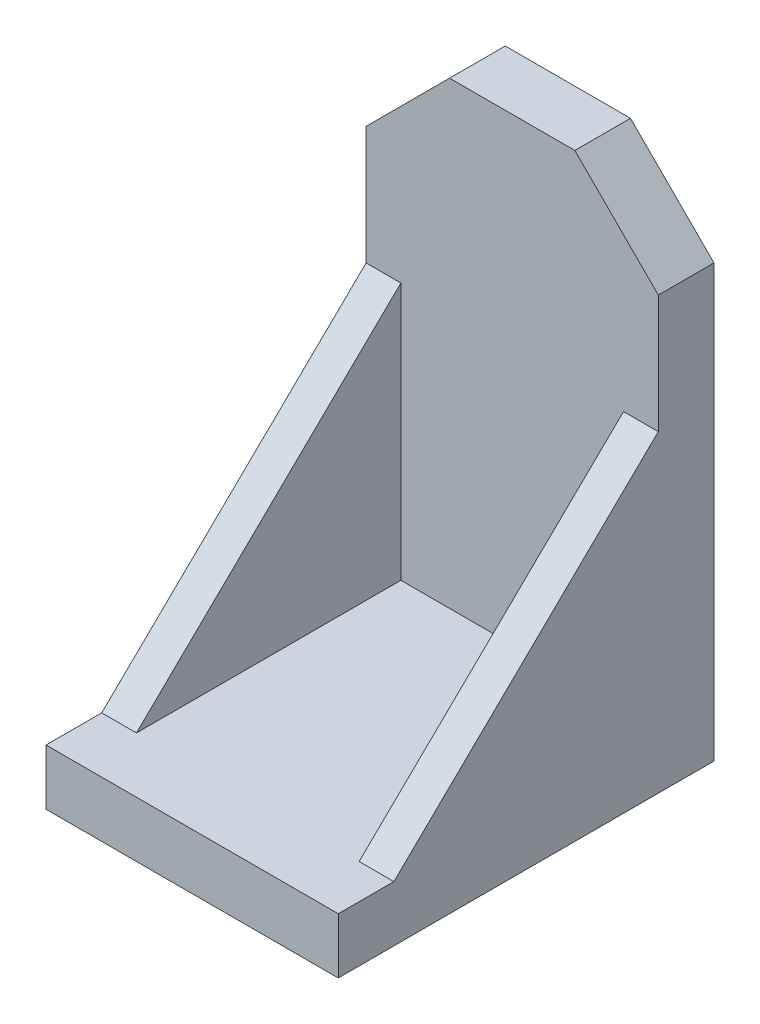
ISO-10303-21;
HEADER;
FILE_DESCRIPTION(('STEP AP214'),'2;1');
FILE_NAME('part.step','',(''),(''),'','','');
FILE_SCHEMA(('AUTOMOTIVE_DESIGN { 1 0 10303 214 1 1 1 1 }'));
ENDSEC;
DATA;
#1=APPLICATION_CONTEXT('core data for automotive mechanical design processes');
#2=APPLICATION_PROTOCOL_DEFINITION('international standard','automotive_design',2000,#1);
#3=PRODUCT_CONTEXT('',#1,'mechanical');
#4=PRODUCT('Part','Part','',(#3));
#5=PRODUCT_RELATED_PRODUCT_CATEGORY('part','',(#4));
#6=PRODUCT_DEFINITION_FORMATION('','',#4);
#7=PRODUCT_DEFINITION_CONTEXT('part definition',#1,'design');
#8=PRODUCT_DEFINITION('design','',#6,#7);
#9=PRODUCT_DEFINITION_SHAPE('','',#8);
#10=(LENGTH_UNIT() NAMED_UNIT(*) SI_UNIT(.MILLI.,.METRE.));
#11=(NAMED_UNIT(*) PLANE_ANGLE_UNIT() SI_UNIT($,.RADIAN.));
#12=(NAMED_UNIT(*) SI_UNIT($,.STERADIAN.) SOLID_ANGLE_UNIT());
#13=UNCERTAINTY_MEASURE_WITH_UNIT(LENGTH_MEASURE(1.E-05),#10,'distance_accuracy_value','');
#14=(GEOMETRIC_REPRESENTATION_CONTEXT(3) GLOBAL_UNCERTAINTY_ASSIGNED_CONTEXT((#13)) GLOBAL_UNIT_ASSIGNED_CONTEXT((#10,
#11,#12)) REPRESENTATION_CONTEXT('',''));
#15=CARTESIAN_POINT('',(0.,0.,0.));
#16=DIRECTION('',(0.,0.,1.));
#17=DIRECTION('',(1.,0.,0.));
#18=AXIS2_PLACEMENT_3D('',#15,#16,#17);
#19=CARTESIAN_POINT('',(0.,0.,8.));
#20=DIRECTION('',(0.,0.,-1.));
#21=DIRECTION('',(-1.,0.,0.));
#22=AXIS2_PLACEMENT_3D('',#19,#20,#21);
#23=PLANE('',#22);
#24=DIRECTION('',(0.,-1.,0.));
#25=VECTOR('',#24,1.);
#26=CARTESIAN_POINT('',(0.,0.,8.));
#27=LINE('',#26,#25);
#28=CARTESIAN_POINT('',(0.,62.,8.));
#29=VERTEX_POINT('',#28);
#30=CARTESIAN_POINT('',(0.,45.,8.));
#31=VERTEX_POINT('',#30);
#32=EDGE_CURVE('E57',#29,#31,#27,.T.);
#33=ORIENTED_EDGE('',*,*,#32,.T.);
#34=DIRECTION('',(-1.,0.,0.));
#35=VECTOR('',#34,1.);
#36=CARTESIAN_POINT('',(5.,45.,8.));
#37=LINE('',#36,#35);
#38=CARTESIAN_POINT('',(5.,45.,8.));
#39=VERTEX_POINT('',#38);
#40=EDGE_CURVE('E52',#39,#31,#37,.T.);
#41=ORIENTED_EDGE('',*,*,#40,.F.);
#42=DIRECTION('',(0.,1.,0.));
#43=VECTOR('',#42,1.);
#44=CARTESIAN_POINT('',(5.,7.99999999999999,8.));
#45=LINE('',#44,#43);
#46=CARTESIAN_POINT('',(5.,8.,8.));
#47=VERTEX_POINT('',#46);
#48=EDGE_CURVE('E137',#47,#39,#45,.T.);
#49=ORIENTED_EDGE('',*,*,#48,.F.);
#50=DIRECTION('',(-1.,0.,0.));
#51=VECTOR('',#50,1.);
#52=CARTESIAN_POINT('',(42.,8.,8.));
#53=LINE('',#52,#51);
#54=CARTESIAN_POINT('',(37.,8.,8.));
#55=VERTEX_POINT('',#54);
#56=EDGE_CURVE('E125',#55,#47,#53,.T.);
#57=ORIENTED_EDGE('',*,*,#56,.F.);
#58=DIRECTION('',(0.,1.,0.));
#59=VECTOR('',#58,1.);
#60=CARTESIAN_POINT('',(37.,7.99999999999999,8.));
#61=LINE('',#60,#59);
#62=CARTESIAN_POINT('',(37.,45.,8.));
#63=VERTEX_POINT('',#62);
#64=EDGE_CURVE('E154',#55,#63,#61,.T.);
#65=ORIENTED_EDGE('',*,*,#64,.T.);
#66=DIRECTION('',(1.,0.,0.));
#67=VECTOR('',#66,1.);
#68=CARTESIAN_POINT('',(37.,45.,8.));
#69=LINE('',#68,#67);
#70=CARTESIAN_POINT('',(42.,45.,8.));
#71=VERTEX_POINT('',#70);
#72=EDGE_CURVE('E159',#63,#71,#69,.T.);
#73=ORIENTED_EDGE('',*,*,#72,.T.);
#74=DIRECTION('',(0.,1.,0.));
#75=VECTOR('',#74,1.);
#76=CARTESIAN_POINT('',(42.,62.,8.));
#77=LINE('',#76,#75);
#78=CARTESIAN_POINT('',(42.,62.,8.));
#79=VERTEX_POINT('',#78);
#80=EDGE_CURVE('E180',#71,#79,#77,.T.);
#81=ORIENTED_EDGE('',*,*,#80,.T.);
#82=DIRECTION('',(-0.707106781186548,0.707106781186547,0.));
#83=VECTOR('',#82,1.);
#84=CARTESIAN_POINT('',(30.,74.,8.));
#85=LINE('',#84,#83);
#86=CARTESIAN_POINT('',(30.,74.,8.));
#87=VERTEX_POINT('',#86);
#88=EDGE_CURVE('E182',#79,#87,#85,.T.);
#89=ORIENTED_EDGE('',*,*,#88,.T.);
#90=DIRECTION('',(-1.,0.,0.));
#91=VECTOR('',#90,1.);
#92=CARTESIAN_POINT('',(12.,74.,8.));
#93=LINE('',#92,#91);
#94=CARTESIAN_POINT('',(12.,74.,8.));
#95=VERTEX_POINT('',#94);
#96=EDGE_CURVE('E185',#87,#95,#93,.T.);
#97=ORIENTED_EDGE('',*,*,#96,.T.);
#98=DIRECTION('',(-0.707106781186547,-0.707106781186548,0.));
#99=VECTOR('',#98,1.);
#100=CARTESIAN_POINT('',(0.,62.,8.));
#101=LINE('',#100,#99);
#102=EDGE_CURVE('E187',#95,#29,#101,.T.);
#103=ORIENTED_EDGE('',*,*,#102,.T.);
#104=EDGE_LOOP('',(#33,#41,#49,#57,#65,#73,#81,#89,#97,#103));
#105=FACE_BOUND('',#104,.T.);
#106=ADVANCED_FACE('F37',(#105),#23,.F.);
#107=CARTESIAN_POINT('',(42.,0.,8.));
#108=DIRECTION('',(0.,1.,0.));
#109=DIRECTION('',(0.,0.,1.));
#110=AXIS2_PLACEMENT_3D('',#107,#108,#109);
#111=PLANE('',#110);
#112=DIRECTION('',(1.,0.,0.));
#113=VECTOR('',#112,1.);
#114=CARTESIAN_POINT('',(42.,0.,0.));
#115=LINE('',#114,#113);
#116=CARTESIAN_POINT('',(0.,0.,0.));
#117=VERTEX_POINT('',#116);
#118=CARTESIAN_POINT('',(42.,0.,0.));
#119=VERTEX_POINT('',#118);
#120=EDGE_CURVE('E179',#117,#119,#115,.T.);
#121=ORIENTED_EDGE('',*,*,#120,.T.);
#122=DIRECTION('',(0.,0.,-1.));
#123=VECTOR('',#122,1.);
#124=CARTESIAN_POINT('',(42.,0.,8.));
#125=LINE('',#124,#123);
#126=CARTESIAN_POINT('',(42.,0.,54.));
#127=VERTEX_POINT('',#126);
#128=EDGE_CURVE('E11',#127,#119,#125,.T.);
#129=ORIENTED_EDGE('',*,*,#128,.F.);
#130=DIRECTION('',(1.,0.,0.));
#131=VECTOR('',#130,1.);
#132=CARTESIAN_POINT('',(0.,0.,54.));
#133=LINE('',#132,#131);
#134=CARTESIAN_POINT('',(0.,0.,54.));
#135=VERTEX_POINT('',#134);
#136=EDGE_CURVE('E167',#135,#127,#133,.T.);
#137=ORIENTED_EDGE('',*,*,#136,.F.);
#138=DIRECTION('',(0.,0.,-1.));
#139=VECTOR('',#138,1.);
#140=CARTESIAN_POINT('',(0.,0.,8.));
#141=LINE('',#140,#139);
#142=EDGE_CURVE('E190',#135,#117,#141,.T.);
#143=ORIENTED_EDGE('',*,*,#142,.T.);
#144=EDGE_LOOP('',(#121,#129,#137,#143));
#145=FACE_BOUND('',#144,.T.);
#146=ADVANCED_FACE('F39',(#145),#111,.F.);
#147=CARTESIAN_POINT('',(42.,62.,8.));
#148=DIRECTION('',(-1.,0.,0.));
#149=DIRECTION('',(0.,0.,1.));
#150=AXIS2_PLACEMENT_3D('',#147,#148,#149);
#151=PLANE('',#150);
#152=ORIENTED_EDGE('',*,*,#80,.F.);
#153=DIRECTION('',(0.,-0.697616683154663,0.716471188104789));
#154=VECTOR('',#153,1.);
#155=CARTESIAN_POINT('',(42.,45.,8.));
#156=LINE('',#155,#154);
#157=CARTESIAN_POINT('',(42.,8.,46.));
#158=VERTEX_POINT('',#157);
#159=EDGE_CURVE('E151',#71,#158,#156,.T.);
#160=ORIENTED_EDGE('',*,*,#159,.T.);
#161=DIRECTION('',(0.,0.,-1.));
#162=VECTOR('',#161,1.);
#163=CARTESIAN_POINT('',(42.,8.,54.));
#164=LINE('',#163,#162);
#165=CARTESIAN_POINT('',(42.,8.,54.));
#166=VERTEX_POINT('',#165);
#167=EDGE_CURVE('E177',#166,#158,#164,.T.);
#168=ORIENTED_EDGE('',*,*,#167,.F.);
#169=DIRECTION('',(0.,1.,0.));
#170=VECTOR('',#169,1.);
#171=CARTESIAN_POINT('',(42.,0.,54.));
#172=LINE('',#171,#170);
#173=EDGE_CURVE('E170',#127,#166,#172,.T.);
#174=ORIENTED_EDGE('',*,*,#173,.F.);
#175=ORIENTED_EDGE('',*,*,#128,.T.);
#176=DIRECTION('',(0.,1.,0.));
#177=VECTOR('',#176,1.);
#178=CARTESIAN_POINT('',(42.,62.,0.));
#179=LINE('',#178,#177);
#180=CARTESIAN_POINT('',(42.,62.,0.));
#181=VERTEX_POINT('',#180);
#182=EDGE_CURVE('E193',#119,#181,#179,.T.);
#183=ORIENTED_EDGE('',*,*,#182,.T.);
#184=DIRECTION('',(0.,0.,-1.));
#185=VECTOR('',#184,1.);
#186=CARTESIAN_POINT('',(42.,62.,8.));
#187=LINE('',#186,#185);
#188=EDGE_CURVE('E45',#79,#181,#187,.T.);
#189=ORIENTED_EDGE('',*,*,#188,.F.);
#190=EDGE_LOOP('',(#152,#160,#168,#174,#175,#183,#189));
#191=FACE_BOUND('',#190,.T.);
#192=ADVANCED_FACE('F237',(#191),#151,.F.);
#193=CARTESIAN_POINT('',(30.,74.,8.));
#194=DIRECTION('',(-0.707106781186547,-0.707106781186548,0.));
#195=DIRECTION('',(0.707106781186548,-0.707106781186547,0.));
#196=AXIS2_PLACEMENT_3D('',#193,#194,#195);
#197=PLANE('',#196);
#198=DIRECTION('',(-0.707106781186548,0.707106781186547,0.));
#199=VECTOR('',#198,1.);
#200=CARTESIAN_POINT('',(30.,74.,0.));
#201=LINE('',#200,#199);
#202=CARTESIAN_POINT('',(30.,74.,0.));
#203=VERTEX_POINT('',#202);
#204=EDGE_CURVE('E195',#181,#203,#201,.T.);
#205=ORIENTED_EDGE('',*,*,#204,.T.);
#206=DIRECTION('',(0.,0.,-1.));
#207=VECTOR('',#206,1.);
#208=CARTESIAN_POINT('',(30.,74.,8.));
#209=LINE('',#208,#207);
#210=EDGE_CURVE('E210',#87,#203,#209,.T.);
#211=ORIENTED_EDGE('',*,*,#210,.F.);
#212=ORIENTED_EDGE('',*,*,#88,.F.);
#213=ORIENTED_EDGE('',*,*,#188,.T.);
#214=EDGE_LOOP('',(#205,#211,#212,#213));
#215=FACE_BOUND('',#214,.T.);
#216=ADVANCED_FACE('F217',(#215),#197,.F.);
#217=CARTESIAN_POINT('',(12.,74.,8.));
#218=DIRECTION('',(0.,-1.,0.));
#219=DIRECTION('',(1.,0.,0.));
#220=AXIS2_PLACEMENT_3D('',#217,#218,#219);
#221=PLANE('',#220);
#222=DIRECTION('',(-1.,0.,0.));
#223=VECTOR('',#222,1.);
#224=CARTESIAN_POINT('',(12.,74.,0.));
#225=LINE('',#224,#223);
#226=CARTESIAN_POINT('',(12.,74.,0.));
#227=VERTEX_POINT('',#226);
#228=EDGE_CURVE('E197',#203,#227,#225,.T.);
#229=ORIENTED_EDGE('',*,*,#228,.T.);
#230=DIRECTION('',(0.,0.,-1.));
#231=VECTOR('',#230,1.);
#232=CARTESIAN_POINT('',(12.,74.,8.));
#233=LINE('',#232,#231);
#234=EDGE_CURVE('E207',#95,#227,#233,.T.);
#235=ORIENTED_EDGE('',*,*,#234,.F.);
#236=ORIENTED_EDGE('',*,*,#96,.F.);
#237=ORIENTED_EDGE('',*,*,#210,.T.);
#238=EDGE_LOOP('',(#229,#235,#236,#237));
#239=FACE_BOUND('',#238,.T.);
#240=ADVANCED_FACE('F229',(#239),#221,.F.);
#241=CARTESIAN_POINT('',(0.,62.,8.));
#242=DIRECTION('',(0.707106781186548,-0.707106781186547,0.));
#243=DIRECTION('',(0.707106781186547,0.707106781186548,0.));
#244=AXIS2_PLACEMENT_3D('',#241,#242,#243);
#245=PLANE('',#244);
#246=DIRECTION('',(-0.707106781186547,-0.707106781186548,0.));
#247=VECTOR('',#246,1.);
#248=CARTESIAN_POINT('',(0.,62.,0.));
#249=LINE('',#248,#247);
#250=CARTESIAN_POINT('',(0.,62.,0.));
#251=VERTEX_POINT('',#250);
#252=EDGE_CURVE('E199',#227,#251,#249,.T.);
#253=ORIENTED_EDGE('',*,*,#252,.T.);
#254=DIRECTION('',(0.,0.,-1.));
#255=VECTOR('',#254,1.);
#256=CARTESIAN_POINT('',(0.,62.,8.));
#257=LINE('',#256,#255);
#258=EDGE_CURVE('E204',#29,#251,#257,.T.);
#259=ORIENTED_EDGE('',*,*,#258,.F.);
#260=ORIENTED_EDGE('',*,*,#102,.F.);
#261=ORIENTED_EDGE('',*,*,#234,.T.);
#262=EDGE_LOOP('',(#253,#259,#260,#261));
#263=FACE_BOUND('',#262,.T.);
#264=ADVANCED_FACE('F233',(#263),#245,.F.);
#265=CARTESIAN_POINT('',(0.,0.,8.));
#266=DIRECTION('',(1.,0.,0.));
#267=DIRECTION('',(0.,0.,-1.));
#268=AXIS2_PLACEMENT_3D('',#265,#266,#267);
#269=PLANE('',#268);
#270=DIRECTION('',(0.,-1.,0.));
#271=VECTOR('',#270,1.);
#272=CARTESIAN_POINT('',(0.,0.,0.));
#273=LINE('',#272,#271);
#274=EDGE_CURVE('E183',#251,#117,#273,.T.);
#275=ORIENTED_EDGE('',*,*,#274,.T.);
#276=ORIENTED_EDGE('',*,*,#142,.F.);
#277=DIRECTION('',(0.,-1.,0.));
#278=VECTOR('',#277,1.);
#279=CARTESIAN_POINT('',(0.,7.99999999999999,54.));
#280=LINE('',#279,#278);
#281=CARTESIAN_POINT('',(0.,7.99999999999999,54.));
#282=VERTEX_POINT('',#281);
#283=EDGE_CURVE('E133',#282,#135,#280,.T.);
#284=ORIENTED_EDGE('',*,*,#283,.F.);
#285=DIRECTION('',(0.,0.,-1.));
#286=VECTOR('',#285,1.);
#287=CARTESIAN_POINT('',(0.,7.99999999999999,54.));
#288=LINE('',#287,#286);
#289=CARTESIAN_POINT('',(0.,7.99999999999999,46.));
#290=VERTEX_POINT('',#289);
#291=EDGE_CURVE('E173',#282,#290,#288,.T.);
#292=ORIENTED_EDGE('',*,*,#291,.T.);
#293=DIRECTION('',(0.,-0.697616683154663,0.716471188104789));
#294=VECTOR('',#293,1.);
#295=CARTESIAN_POINT('',(0.,45.,8.));
#296=LINE('',#295,#294);
#297=EDGE_CURVE('E143',#31,#290,#296,.T.);
#298=ORIENTED_EDGE('',*,*,#297,.F.);
#299=ORIENTED_EDGE('',*,*,#32,.F.);
#300=ORIENTED_EDGE('',*,*,#258,.T.);
#301=EDGE_LOOP('',(#275,#276,#284,#292,#298,#299,#300));
#302=FACE_BOUND('',#301,.T.);
#303=ADVANCED_FACE('F267',(#302),#269,.F.);
#304=CARTESIAN_POINT('',(0.,0.,0.));
#305=DIRECTION('',(0.,0.,-1.));
#306=DIRECTION('',(-1.,0.,0.));
#307=AXIS2_PLACEMENT_3D('',#304,#305,#306);
#308=PLANE('',#307);
#309=ORIENTED_EDGE('',*,*,#120,.F.);
#310=ORIENTED_EDGE('',*,*,#274,.F.);
#311=ORIENTED_EDGE('',*,*,#252,.F.);
#312=ORIENTED_EDGE('',*,*,#228,.F.);
#313=ORIENTED_EDGE('',*,*,#204,.F.);
#314=ORIENTED_EDGE('',*,*,#182,.F.);
#315=EDGE_LOOP('',(#309,#310,#311,#312,#313,#314));
#316=FACE_BOUND('',#315,.T.);
#317=ADVANCED_FACE('F224',(#316),#308,.T.);
#318=CARTESIAN_POINT('',(42.,8.,54.));
#319=DIRECTION('',(0.,-1.,0.));
#320=DIRECTION('',(1.,0.,0.));
#321=AXIS2_PLACEMENT_3D('',#318,#319,#320);
#322=PLANE('',#321);
#323=DIRECTION('',(0.,0.,-1.));
#324=VECTOR('',#323,1.);
#325=CARTESIAN_POINT('',(5.,8.,46.));
#326=LINE('',#325,#324);
#327=CARTESIAN_POINT('',(5.,7.99999999999999,46.));
#328=VERTEX_POINT('',#327);
#329=EDGE_CURVE('E128',#328,#47,#326,.T.);
#330=ORIENTED_EDGE('',*,*,#329,.F.);
#331=DIRECTION('',(-1.,0.,0.));
#332=VECTOR('',#331,1.);
#333=CARTESIAN_POINT('',(5.,8.,46.));
#334=LINE('',#333,#332);
#335=EDGE_CURVE('E149',#328,#290,#334,.T.);
#336=ORIENTED_EDGE('',*,*,#335,.T.);
#337=ORIENTED_EDGE('',*,*,#291,.F.);
#338=DIRECTION('',(-1.,0.,0.));
#339=VECTOR('',#338,1.);
#340=CARTESIAN_POINT('',(42.,8.,54.));
#341=LINE('',#340,#339);
#342=EDGE_CURVE('E172',#166,#282,#341,.T.);
#343=ORIENTED_EDGE('',*,*,#342,.F.);
#344=ORIENTED_EDGE('',*,*,#167,.T.);
#345=DIRECTION('',(1.,0.,0.));
#346=VECTOR('',#345,1.);
#347=CARTESIAN_POINT('',(37.,8.,46.));
#348=LINE('',#347,#346);
#349=CARTESIAN_POINT('',(37.,8.,46.));
#350=VERTEX_POINT('',#349);
#351=EDGE_CURVE('E134',#350,#158,#348,.T.);
#352=ORIENTED_EDGE('',*,*,#351,.F.);
#353=DIRECTION('',(0.,0.,-1.));
#354=VECTOR('',#353,1.);
#355=CARTESIAN_POINT('',(37.,8.,46.));
#356=LINE('',#355,#354);
#357=EDGE_CURVE('E131',#350,#55,#356,.T.);
#358=ORIENTED_EDGE('',*,*,#357,.T.);
#359=ORIENTED_EDGE('',*,*,#56,.T.);
#360=EDGE_LOOP('',(#330,#336,#337,#343,#344,#352,#358,#359));
#361=FACE_BOUND('',#360,.T.);
#362=ADVANCED_FACE('F126',(#361),#322,.F.);
#363=CARTESIAN_POINT('',(0.,0.,54.));
#364=DIRECTION('',(0.,0.,1.));
#365=DIRECTION('',(1.,0.,0.));
#366=AXIS2_PLACEMENT_3D('',#363,#364,#365);
#367=PLANE('',#366);
#368=ORIENTED_EDGE('',*,*,#283,.T.);
#369=ORIENTED_EDGE('',*,*,#136,.T.);
#370=ORIENTED_EDGE('',*,*,#173,.T.);
#371=ORIENTED_EDGE('',*,*,#342,.T.);
#372=EDGE_LOOP('',(#368,#369,#370,#371));
#373=FACE_BOUND('',#372,.T.);
#374=ADVANCED_FACE('F254',(#373),#367,.T.);
#375=CARTESIAN_POINT('',(37.,45.,8.));
#376=DIRECTION('',(0.,0.716471188104788,0.697616683154663));
#377=DIRECTION('',(0.,-0.697616683154663,0.716471188104788));
#378=AXIS2_PLACEMENT_3D('',#375,#376,#377);
#379=PLANE('',#378);
#380=ORIENTED_EDGE('',*,*,#159,.F.);
#381=ORIENTED_EDGE('',*,*,#72,.F.);
#382=DIRECTION('',(0.,-0.697616683154663,0.716471188104789));
#383=VECTOR('',#382,1.);
#384=CARTESIAN_POINT('',(37.,45.,8.));
#385=LINE('',#384,#383);
#386=EDGE_CURVE('E156',#63,#350,#385,.T.);
#387=ORIENTED_EDGE('',*,*,#386,.T.);
#388=ORIENTED_EDGE('',*,*,#351,.T.);
#389=EDGE_LOOP('',(#380,#381,#387,#388));
#390=FACE_BOUND('',#389,.T.);
#391=ADVANCED_FACE('F240',(#390),#379,.T.);
#392=CARTESIAN_POINT('',(37.,0.,0.));
#393=DIRECTION('',(1.,0.,0.));
#394=DIRECTION('',(0.,0.,-1.));
#395=AXIS2_PLACEMENT_3D('',#392,#393,#394);
#396=PLANE('',#395);
#397=ORIENTED_EDGE('',*,*,#357,.F.);
#398=ORIENTED_EDGE('',*,*,#386,.F.);
#399=ORIENTED_EDGE('',*,*,#64,.F.);
#400=EDGE_LOOP('',(#397,#398,#399));
#401=FACE_BOUND('',#400,.T.);
#402=ADVANCED_FACE('F244',(#401),#396,.F.);
#403=CARTESIAN_POINT('',(5.,45.,8.));
#404=DIRECTION('',(0.,0.716471188104788,0.697616683154663));
#405=DIRECTION('',(0.,-0.697616683154663,0.716471188104788));
#406=AXIS2_PLACEMENT_3D('',#403,#404,#405);
#407=PLANE('',#406);
#408=ORIENTED_EDGE('',*,*,#297,.T.);
#409=ORIENTED_EDGE('',*,*,#335,.F.);
#410=DIRECTION('',(0.,-0.697616683154663,0.716471188104789));
#411=VECTOR('',#410,1.);
#412=CARTESIAN_POINT('',(5.,45.,8.));
#413=LINE('',#412,#411);
#414=EDGE_CURVE('E139',#39,#328,#413,.T.);
#415=ORIENTED_EDGE('',*,*,#414,.F.);
#416=ORIENTED_EDGE('',*,*,#40,.T.);
#417=EDGE_LOOP('',(#408,#409,#415,#416));
#418=FACE_BOUND('',#417,.T.);
#419=ADVANCED_FACE('F246',(#418),#407,.T.);
#420=CARTESIAN_POINT('',(5.,0.,0.));
#421=DIRECTION('',(-1.,0.,0.));
#422=DIRECTION('',(0.,0.,-1.));
#423=AXIS2_PLACEMENT_3D('',#420,#421,#422);
#424=PLANE('',#423);
#425=ORIENTED_EDGE('',*,*,#329,.T.);
#426=ORIENTED_EDGE('',*,*,#48,.T.);
#427=ORIENTED_EDGE('',*,*,#414,.T.);
#428=EDGE_LOOP('',(#425,#426,#427));
#429=FACE_BOUND('',#428,.T.);
#430=ADVANCED_FACE('F141',(#429),#424,.F.);
#431=CLOSED_SHELL('',(#106,#146,#192,#216,#240,#264,#303,#317,#362,#374,#391,#402,#419,#430));
#432=MANIFOLD_SOLID_BREP('B2',#431);
#433=ADVANCED_BREP_SHAPE_REPRESENTATION('',(#18,#432),#14);
#434=SHAPE_DEFINITION_REPRESENTATION(#9,#433);
ENDSEC;
END-ISO-10303-21;
